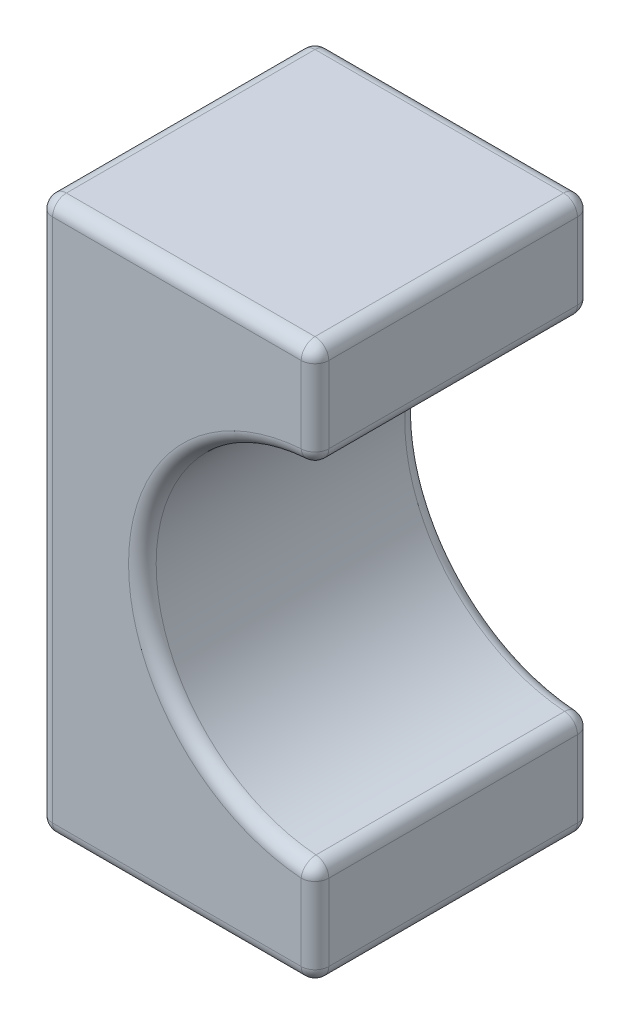
ISO-10303-21;
HEADER;
FILE_DESCRIPTION(('STEP AP214'),'2;1');
FILE_NAME('part.step','',(''),(''),'','','');
FILE_SCHEMA(('AUTOMOTIVE_DESIGN { 1 0 10303 214 1 1 1 1 }'));
ENDSEC;
DATA;
#1=APPLICATION_CONTEXT('core data for automotive mechanical design processes');
#2=APPLICATION_PROTOCOL_DEFINITION('international standard','automotive_design',2000,#1);
#3=PRODUCT_CONTEXT('',#1,'mechanical');
#4=PRODUCT('Part','Part','',(#3));
#5=PRODUCT_RELATED_PRODUCT_CATEGORY('part','',(#4));
#6=PRODUCT_DEFINITION_FORMATION('','',#4);
#7=PRODUCT_DEFINITION_CONTEXT('part definition',#1,'design');
#8=PRODUCT_DEFINITION('design','',#6,#7);
#9=PRODUCT_DEFINITION_SHAPE('','',#8);
#10=(LENGTH_UNIT() NAMED_UNIT(*) SI_UNIT(.MILLI.,.METRE.));
#11=(NAMED_UNIT(*) PLANE_ANGLE_UNIT() SI_UNIT($,.RADIAN.));
#12=(NAMED_UNIT(*) SI_UNIT($,.STERADIAN.) SOLID_ANGLE_UNIT());
#13=UNCERTAINTY_MEASURE_WITH_UNIT(LENGTH_MEASURE(1.E-05),#10,'distance_accuracy_value','');
#14=(GEOMETRIC_REPRESENTATION_CONTEXT(3) GLOBAL_UNCERTAINTY_ASSIGNED_CONTEXT((#13)) GLOBAL_UNIT_ASSIGNED_CONTEXT((#10,
#11,#12)) REPRESENTATION_CONTEXT('',''));
#15=CARTESIAN_POINT('',(0.,0.,0.));
#16=DIRECTION('',(0.,0.,1.));
#17=DIRECTION('',(1.,0.,0.));
#18=AXIS2_PLACEMENT_3D('',#15,#16,#17);
#19=CARTESIAN_POINT('',(10.,40.,10.));
#20=DIRECTION('',(-1.,0.,0.));
#21=DIRECTION('',(0.,0.,1.));
#22=AXIS2_PLACEMENT_3D('',#19,#20,#21);
#23=PLANE('',#22);
#24=DIRECTION('',(0.,-1.,0.));
#25=VECTOR('',#24,1.);
#26=CARTESIAN_POINT('',(10.,40.,-9.));
#27=LINE('',#26,#25);
#28=CARTESIAN_POINT('',(10.,33.4629120178363,-9.));
#29=VERTEX_POINT('',#28);
#30=CARTESIAN_POINT('',(10.,39.,-9.));
#31=VERTEX_POINT('',#30);
#32=EDGE_CURVE('E349',#29,#31,#27,.F.);
#33=ORIENTED_EDGE('',*,*,#32,.T.);
#34=DIRECTION('',(0.,0.,-1.));
#35=VECTOR('',#34,1.);
#36=CARTESIAN_POINT('',(10.,39.,10.));
#37=LINE('',#36,#35);
#38=CARTESIAN_POINT('',(10.,39.,9.));
#39=VERTEX_POINT('',#38);
#40=EDGE_CURVE('E11',#31,#39,#37,.F.);
#41=ORIENTED_EDGE('',*,*,#40,.T.);
#42=DIRECTION('',(0.,-1.,0.));
#43=VECTOR('',#42,1.);
#44=CARTESIAN_POINT('',(10.,40.,9.));
#45=LINE('',#44,#43);
#46=CARTESIAN_POINT('',(10.,33.4629120178363,9.));
#47=VERTEX_POINT('',#46);
#48=EDGE_CURVE('E346',#39,#47,#45,.T.);
#49=ORIENTED_EDGE('',*,*,#48,.T.);
#50=DIRECTION('',(0.,0.,-1.));
#51=VECTOR('',#50,1.);
#52=CARTESIAN_POINT('',(10.,33.4629120178363,-9.00000000000001));
#53=LINE('',#52,#51);
#54=EDGE_CURVE('E45',#47,#29,#53,.T.);
#55=ORIENTED_EDGE('',*,*,#54,.T.);
#56=EDGE_LOOP('',(#33,#41,#49,#55));
#57=FACE_BOUND('',#56,.T.);
#58=ADVANCED_FACE('F36',(#57),#23,.F.);
#59=CARTESIAN_POINT('',(9.,40.,-9.));
#60=DIRECTION('',(0.,-1.,0.));
#61=DIRECTION('',(0.,0.,-1.));
#62=AXIS2_PLACEMENT_3D('',#59,#60,#61);
#63=CYLINDRICAL_SURFACE('',#62,1.);
#64=DIRECTION('',(0.,-1.,0.));
#65=VECTOR('',#64,1.);
#66=CARTESIAN_POINT('',(9.,40.,-10.));
#67=LINE('',#66,#65);
#68=CARTESIAN_POINT('',(9.,39.,-10.));
#69=VERTEX_POINT('',#68);
#70=CARTESIAN_POINT('',(9.,33.4629120178363,-10.));
#71=VERTEX_POINT('',#70);
#72=EDGE_CURVE('E347',#69,#71,#67,.T.);
#73=ORIENTED_EDGE('',*,*,#72,.F.);
#74=CARTESIAN_POINT('',(9.,39.,-9.));
#75=DIRECTION('',(0.,-1.,0.));
#76=DIRECTION('',(0.,0.,-1.));
#77=AXIS2_PLACEMENT_3D('',#74,#75,#76);
#78=CIRCLE('',#77,1.);
#79=EDGE_CURVE('E242',#69,#31,#78,.T.);
#80=ORIENTED_EDGE('',*,*,#79,.T.);
#81=ORIENTED_EDGE('',*,*,#32,.F.);
#82=CARTESIAN_POINT('',(9.,33.4629120178363,-9.));
#83=DIRECTION('',(0.,-1.,0.));
#84=DIRECTION('',(0.,0.,-1.));
#85=AXIS2_PLACEMENT_3D('',#82,#83,#84);
#86=CIRCLE('',#85,1.);
#87=EDGE_CURVE('E239',#29,#71,#86,.F.);
#88=ORIENTED_EDGE('',*,*,#87,.T.);
#89=EDGE_LOOP('',(#73,#80,#81,#88));
#90=FACE_BOUND('',#89,.T.);
#91=ADVANCED_FACE('F394',(#90),#63,.T.);
#92=CARTESIAN_POINT('',(9.,6.53708798216374,-10.));
#93=VERTEX_POINT('',#92);
#94=CARTESIAN_POINT('',(9.,1.,-10.));
#95=VERTEX_POINT('',#94);
#96=EDGE_CURVE('E351',#93,#95,#67,.T.);
#97=ORIENTED_EDGE('',*,*,#96,.F.);
#98=CARTESIAN_POINT('',(9.,6.53708798216374,-9.));
#99=DIRECTION('',(0.,-1.,0.));
#100=DIRECTION('',(0.,0.,-1.));
#101=AXIS2_PLACEMENT_3D('',#98,#99,#100);
#102=CIRCLE('',#101,1.);
#103=CARTESIAN_POINT('',(10.,6.53708798216374,-9.));
#104=VERTEX_POINT('',#103);
#105=EDGE_CURVE('E254',#93,#104,#102,.T.);
#106=ORIENTED_EDGE('',*,*,#105,.T.);
#107=CARTESIAN_POINT('',(10.,1.,-9.));
#108=VERTEX_POINT('',#107);
#109=EDGE_CURVE('E355',#108,#104,#27,.F.);
#110=ORIENTED_EDGE('',*,*,#109,.F.);
#111=CARTESIAN_POINT('',(9.,1.,-9.));
#112=DIRECTION('',(0.,-1.,0.));
#113=DIRECTION('',(0.,0.,-1.));
#114=AXIS2_PLACEMENT_3D('',#111,#112,#113);
#115=CIRCLE('',#114,1.);
#116=EDGE_CURVE('E252',#108,#95,#115,.F.);
#117=ORIENTED_EDGE('',*,*,#116,.T.);
#118=EDGE_LOOP('',(#97,#106,#110,#117));
#119=FACE_BOUND('',#118,.T.);
#120=ADVANCED_FACE('F412',(#119),#63,.T.);
#121=CARTESIAN_POINT('',(9.,40.,9.));
#122=DIRECTION('',(0.,-1.,0.));
#123=DIRECTION('',(0.,0.,-1.));
#124=AXIS2_PLACEMENT_3D('',#121,#122,#123);
#125=CYLINDRICAL_SURFACE('',#124,1.);
#126=ORIENTED_EDGE('',*,*,#48,.F.);
#127=CARTESIAN_POINT('',(9.,39.,9.));
#128=DIRECTION('',(0.,-1.,0.));
#129=DIRECTION('',(0.,0.,-1.));
#130=AXIS2_PLACEMENT_3D('',#127,#128,#129);
#131=CIRCLE('',#130,1.);
#132=CARTESIAN_POINT('',(9.,39.,10.));
#133=VERTEX_POINT('',#132);
#134=EDGE_CURVE('E184',#39,#133,#131,.T.);
#135=ORIENTED_EDGE('',*,*,#134,.T.);
#136=DIRECTION('',(0.,-1.,0.));
#137=VECTOR('',#136,1.);
#138=CARTESIAN_POINT('',(9.,40.,10.));
#139=LINE('',#138,#137);
#140=CARTESIAN_POINT('',(9.,33.4629120178363,10.));
#141=VERTEX_POINT('',#140);
#142=EDGE_CURVE('E166',#141,#133,#139,.F.);
#143=ORIENTED_EDGE('',*,*,#142,.F.);
#144=CARTESIAN_POINT('',(9.,33.4629120178363,9.));
#145=DIRECTION('',(0.,-1.,0.));
#146=DIRECTION('',(0.,0.,-1.));
#147=AXIS2_PLACEMENT_3D('',#144,#145,#146);
#148=CIRCLE('',#147,1.);
#149=EDGE_CURVE('E181',#141,#47,#148,.F.);
#150=ORIENTED_EDGE('',*,*,#149,.T.);
#151=EDGE_LOOP('',(#126,#135,#143,#150));
#152=FACE_BOUND('',#151,.T.);
#153=ADVANCED_FACE('F179',(#152),#125,.T.);
#154=CARTESIAN_POINT('',(10.,6.53708798216374,9.));
#155=VERTEX_POINT('',#154);
#156=CARTESIAN_POINT('',(10.,1.,9.));
#157=VERTEX_POINT('',#156);
#158=EDGE_CURVE('E339',#155,#157,#45,.T.);
#159=ORIENTED_EDGE('',*,*,#158,.F.);
#160=CARTESIAN_POINT('',(9.,6.53708798216374,9.));
#161=DIRECTION('',(0.,-1.,0.));
#162=DIRECTION('',(0.,0.,-1.));
#163=AXIS2_PLACEMENT_3D('',#160,#161,#162);
#164=CIRCLE('',#163,1.);
#165=CARTESIAN_POINT('',(9.,6.53708798216374,10.));
#166=VERTEX_POINT('',#165);
#167=EDGE_CURVE('E262',#155,#166,#164,.T.);
#168=ORIENTED_EDGE('',*,*,#167,.T.);
#169=CARTESIAN_POINT('',(9.,1.,10.));
#170=VERTEX_POINT('',#169);
#171=EDGE_CURVE('E168',#170,#166,#139,.F.);
#172=ORIENTED_EDGE('',*,*,#171,.F.);
#173=CARTESIAN_POINT('',(9.,1.,9.));
#174=DIRECTION('',(0.,-1.,0.));
#175=DIRECTION('',(0.,0.,-1.));
#176=AXIS2_PLACEMENT_3D('',#173,#174,#175);
#177=CIRCLE('',#176,1.);
#178=EDGE_CURVE('E260',#170,#157,#177,.F.);
#179=ORIENTED_EDGE('',*,*,#178,.T.);
#180=EDGE_LOOP('',(#159,#168,#172,#179));
#181=FACE_BOUND('',#180,.T.);
#182=ADVANCED_FACE('F338',(#181),#125,.T.);
#183=ORIENTED_EDGE('',*,*,#109,.T.);
#184=DIRECTION('',(0.,0.,-1.));
#185=VECTOR('',#184,1.);
#186=CARTESIAN_POINT('',(10.,6.53708798216374,9.00000000000001));
#187=LINE('',#186,#185);
#188=EDGE_CURVE('E258',#104,#155,#187,.F.);
#189=ORIENTED_EDGE('',*,*,#188,.T.);
#190=ORIENTED_EDGE('',*,*,#158,.T.);
#191=DIRECTION('',(0.,0.,-1.));
#192=VECTOR('',#191,1.);
#193=CARTESIAN_POINT('',(10.,1.,-9.));
#194=LINE('',#193,#192);
#195=EDGE_CURVE('E256',#157,#108,#194,.T.);
#196=ORIENTED_EDGE('',*,*,#195,.T.);
#197=EDGE_LOOP('',(#183,#189,#190,#196));
#198=FACE_BOUND('',#197,.T.);
#199=ADVANCED_FACE('F343',(#198),#23,.F.);
#200=CARTESIAN_POINT('',(-10.,40.,-10.));
#201=DIRECTION('',(0.,0.,1.));
#202=DIRECTION('',(1.,0.,0.));
#203=AXIS2_PLACEMENT_3D('',#200,#201,#202);
#204=PLANE('',#203);
#205=DIRECTION('',(0.,-1.,0.));
#206=VECTOR('',#205,1.);
#207=CARTESIAN_POINT('',(-9.,40.,-10.));
#208=LINE('',#207,#206);
#209=CARTESIAN_POINT('',(-9.,1.,-10.));
#210=VERTEX_POINT('',#209);
#211=CARTESIAN_POINT('',(-9.,39.,-10.));
#212=VERTEX_POINT('',#211);
#213=EDGE_CURVE('E294',#210,#212,#208,.F.);
#214=ORIENTED_EDGE('',*,*,#213,.T.);
#215=DIRECTION('',(-1.,0.,0.));
#216=VECTOR('',#215,1.);
#217=CARTESIAN_POINT('',(-10.,39.,-10.));
#218=LINE('',#217,#216);
#219=EDGE_CURVE('E237',#212,#69,#218,.F.);
#220=ORIENTED_EDGE('',*,*,#219,.T.);
#221=ORIENTED_EDGE('',*,*,#72,.T.);
#222=CARTESIAN_POINT('',(10.,20.,-10.));
#223=DIRECTION('',(0.,0.,1.));
#224=DIRECTION('',(1.,0.,0.));
#225=AXIS2_PLACEMENT_3D('',#222,#223,#224);
#226=CIRCLE('',#225,13.5);
#227=EDGE_CURVE('E235',#71,#93,#226,.T.);
#228=ORIENTED_EDGE('',*,*,#227,.T.);
#229=ORIENTED_EDGE('',*,*,#96,.T.);
#230=DIRECTION('',(-1.,0.,0.));
#231=VECTOR('',#230,1.);
#232=CARTESIAN_POINT('',(-9.,1.,-10.));
#233=LINE('',#232,#231);
#234=EDGE_CURVE('E233',#95,#210,#233,.T.);
#235=ORIENTED_EDGE('',*,*,#234,.T.);
#236=EDGE_LOOP('',(#214,#220,#221,#228,#229,#235));
#237=FACE_BOUND('',#236,.T.);
#238=ADVANCED_FACE('F392',(#237),#204,.F.);
#239=CARTESIAN_POINT('',(-10.,40.,10.));
#240=DIRECTION('',(1.,0.,0.));
#241=DIRECTION('',(0.,0.,-1.));
#242=AXIS2_PLACEMENT_3D('',#239,#240,#241);
#243=PLANE('',#242);
#244=DIRECTION('',(0.,-1.,0.));
#245=VECTOR('',#244,1.);
#246=CARTESIAN_POINT('',(-10.,40.,9.));
#247=LINE('',#246,#245);
#248=CARTESIAN_POINT('',(-10.,1.,9.));
#249=VERTEX_POINT('',#248);
#250=CARTESIAN_POINT('',(-10.,39.,9.));
#251=VERTEX_POINT('',#250);
#252=EDGE_CURVE('E201',#249,#251,#247,.F.);
#253=ORIENTED_EDGE('',*,*,#252,.T.);
#254=DIRECTION('',(0.,0.,1.));
#255=VECTOR('',#254,1.);
#256=CARTESIAN_POINT('',(-10.,39.,10.));
#257=LINE('',#256,#255);
#258=CARTESIAN_POINT('',(-10.,39.,-9.));
#259=VERTEX_POINT('',#258);
#260=EDGE_CURVE('E226',#251,#259,#257,.F.);
#261=ORIENTED_EDGE('',*,*,#260,.T.);
#262=DIRECTION('',(0.,-1.,0.));
#263=VECTOR('',#262,1.);
#264=CARTESIAN_POINT('',(-10.,40.,-9.));
#265=LINE('',#264,#263);
#266=CARTESIAN_POINT('',(-10.,1.,-9.));
#267=VERTEX_POINT('',#266);
#268=EDGE_CURVE('E206',#259,#267,#265,.T.);
#269=ORIENTED_EDGE('',*,*,#268,.T.);
#270=DIRECTION('',(0.,0.,1.));
#271=VECTOR('',#270,1.);
#272=CARTESIAN_POINT('',(-10.,1.,9.));
#273=LINE('',#272,#271);
#274=EDGE_CURVE('E224',#267,#249,#273,.T.);
#275=ORIENTED_EDGE('',*,*,#274,.T.);
#276=EDGE_LOOP('',(#253,#261,#269,#275));
#277=FACE_BOUND('',#276,.T.);
#278=ADVANCED_FACE('F361',(#277),#243,.F.);
#279=CARTESIAN_POINT('',(-10.,40.,10.));
#280=DIRECTION('',(0.,0.,-1.));
#281=DIRECTION('',(-1.,0.,0.));
#282=AXIS2_PLACEMENT_3D('',#279,#280,#281);
#283=PLANE('',#282);
#284=ORIENTED_EDGE('',*,*,#142,.T.);
#285=DIRECTION('',(1.,0.,0.));
#286=VECTOR('',#285,1.);
#287=CARTESIAN_POINT('',(-10.,39.,10.));
#288=LINE('',#287,#286);
#289=CARTESIAN_POINT('',(-9.,39.,10.));
#290=VERTEX_POINT('',#289);
#291=EDGE_CURVE('E173',#133,#290,#288,.F.);
#292=ORIENTED_EDGE('',*,*,#291,.T.);
#293=DIRECTION('',(0.,-1.,0.));
#294=VECTOR('',#293,1.);
#295=CARTESIAN_POINT('',(-9.,40.,10.));
#296=LINE('',#295,#294);
#297=CARTESIAN_POINT('',(-9.,1.,10.));
#298=VERTEX_POINT('',#297);
#299=EDGE_CURVE('E185',#290,#298,#296,.T.);
#300=ORIENTED_EDGE('',*,*,#299,.T.);
#301=DIRECTION('',(1.,0.,0.));
#302=VECTOR('',#301,1.);
#303=CARTESIAN_POINT('',(9.,1.,10.));
#304=LINE('',#303,#302);
#305=EDGE_CURVE('E174',#298,#170,#304,.T.);
#306=ORIENTED_EDGE('',*,*,#305,.T.);
#307=ORIENTED_EDGE('',*,*,#171,.T.);
#308=CARTESIAN_POINT('',(10.,20.,10.));
#309=DIRECTION('',(0.,0.,-1.));
#310=DIRECTION('',(-1.,0.,0.));
#311=AXIS2_PLACEMENT_3D('',#308,#309,#310);
#312=CIRCLE('',#311,13.5);
#313=EDGE_CURVE('E163',#166,#141,#312,.T.);
#314=ORIENTED_EDGE('',*,*,#313,.T.);
#315=EDGE_LOOP('',(#284,#292,#300,#306,#307,#314));
#316=FACE_BOUND('',#315,.T.);
#317=ADVANCED_FACE('F165',(#316),#283,.F.);
#318=CARTESIAN_POINT('',(0.,40.,0.));
#319=DIRECTION('',(0.,-1.,0.));
#320=DIRECTION('',(0.,0.,-1.));
#321=AXIS2_PLACEMENT_3D('',#318,#319,#320);
#322=PLANE('',#321);
#323=DIRECTION('',(0.,0.,1.));
#324=VECTOR('',#323,1.);
#325=CARTESIAN_POINT('',(-9.,40.,0.));
#326=LINE('',#325,#324);
#327=CARTESIAN_POINT('',(-9.,40.,-9.));
#328=VERTEX_POINT('',#327);
#329=CARTESIAN_POINT('',(-9.,40.,9.));
#330=VERTEX_POINT('',#329);
#331=EDGE_CURVE('E213',#328,#330,#326,.T.);
#332=ORIENTED_EDGE('',*,*,#331,.T.);
#333=DIRECTION('',(1.,0.,0.));
#334=VECTOR('',#333,1.);
#335=CARTESIAN_POINT('',(0.,40.,9.));
#336=LINE('',#335,#334);
#337=CARTESIAN_POINT('',(9.,40.,9.));
#338=VERTEX_POINT('',#337);
#339=EDGE_CURVE('E215',#330,#338,#336,.T.);
#340=ORIENTED_EDGE('',*,*,#339,.T.);
#341=DIRECTION('',(0.,0.,-1.));
#342=VECTOR('',#341,1.);
#343=CARTESIAN_POINT('',(9.,40.,0.));
#344=LINE('',#343,#342);
#345=CARTESIAN_POINT('',(9.,40.,-9.));
#346=VERTEX_POINT('',#345);
#347=EDGE_CURVE('E203',#338,#346,#344,.T.);
#348=ORIENTED_EDGE('',*,*,#347,.T.);
#349=DIRECTION('',(-1.,0.,0.));
#350=VECTOR('',#349,1.);
#351=CARTESIAN_POINT('',(0.,40.,-9.));
#352=LINE('',#351,#350);
#353=EDGE_CURVE('E211',#346,#328,#352,.T.);
#354=ORIENTED_EDGE('',*,*,#353,.T.);
#355=EDGE_LOOP('',(#332,#340,#348,#354));
#356=FACE_BOUND('',#355,.T.);
#357=ADVANCED_FACE('F382',(#356),#322,.F.);
#358=CARTESIAN_POINT('',(0.,0.,0.));
#359=DIRECTION('',(0.,-1.,0.));
#360=DIRECTION('',(0.,0.,-1.));
#361=AXIS2_PLACEMENT_3D('',#358,#359,#360);
#362=PLANE('',#361);
#363=DIRECTION('',(1.,0.,0.));
#364=VECTOR('',#363,1.);
#365=CARTESIAN_POINT('',(-9.,0.,9.));
#366=LINE('',#365,#364);
#367=CARTESIAN_POINT('',(9.,0.,9.));
#368=VERTEX_POINT('',#367);
#369=CARTESIAN_POINT('',(-9.,0.,9.));
#370=VERTEX_POINT('',#369);
#371=EDGE_CURVE('E53',#368,#370,#366,.F.);
#372=ORIENTED_EDGE('',*,*,#371,.T.);
#373=DIRECTION('',(0.,0.,1.));
#374=VECTOR('',#373,1.);
#375=CARTESIAN_POINT('',(-9.,0.,-9.));
#376=LINE('',#375,#374);
#377=CARTESIAN_POINT('',(-9.,0.,-9.));
#378=VERTEX_POINT('',#377);
#379=EDGE_CURVE('E268',#370,#378,#376,.F.);
#380=ORIENTED_EDGE('',*,*,#379,.T.);
#381=DIRECTION('',(-1.,0.,0.));
#382=VECTOR('',#381,1.);
#383=CARTESIAN_POINT('',(9.,0.,-9.));
#384=LINE('',#383,#382);
#385=CARTESIAN_POINT('',(9.,0.,-9.));
#386=VERTEX_POINT('',#385);
#387=EDGE_CURVE('E264',#378,#386,#384,.F.);
#388=ORIENTED_EDGE('',*,*,#387,.T.);
#389=DIRECTION('',(0.,0.,-1.));
#390=VECTOR('',#389,1.);
#391=CARTESIAN_POINT('',(9.,0.,9.));
#392=LINE('',#391,#390);
#393=EDGE_CURVE('E58',#386,#368,#392,.F.);
#394=ORIENTED_EDGE('',*,*,#393,.T.);
#395=EDGE_LOOP('',(#372,#380,#388,#394));
#396=FACE_BOUND('',#395,.T.);
#397=ADVANCED_FACE('F456',(#396),#362,.T.);
#398=CARTESIAN_POINT('',(-9.,40.,9.));
#399=DIRECTION('',(0.,-1.,0.));
#400=DIRECTION('',(0.,0.,-1.));
#401=AXIS2_PLACEMENT_3D('',#398,#399,#400);
#402=CYLINDRICAL_SURFACE('',#401,1.);
#403=ORIENTED_EDGE('',*,*,#299,.F.);
#404=CARTESIAN_POINT('',(-9.,39.,9.));
#405=DIRECTION('',(0.,-1.,0.));
#406=DIRECTION('',(0.,0.,-1.));
#407=AXIS2_PLACEMENT_3D('',#404,#405,#406);
#408=CIRCLE('',#407,1.);
#409=EDGE_CURVE('E222',#290,#251,#408,.T.);
#410=ORIENTED_EDGE('',*,*,#409,.T.);
#411=ORIENTED_EDGE('',*,*,#252,.F.);
#412=CARTESIAN_POINT('',(-9.,1.,9.));
#413=DIRECTION('',(0.,-1.,0.));
#414=DIRECTION('',(0.,0.,-1.));
#415=AXIS2_PLACEMENT_3D('',#412,#413,#414);
#416=CIRCLE('',#415,1.);
#417=EDGE_CURVE('E220',#249,#298,#416,.F.);
#418=ORIENTED_EDGE('',*,*,#417,.T.);
#419=EDGE_LOOP('',(#403,#410,#411,#418));
#420=FACE_BOUND('',#419,.T.);
#421=ADVANCED_FACE('F453',(#420),#402,.T.);
#422=CARTESIAN_POINT('',(-9.,40.,-9.));
#423=DIRECTION('',(0.,-1.,0.));
#424=DIRECTION('',(0.,0.,-1.));
#425=AXIS2_PLACEMENT_3D('',#422,#423,#424);
#426=CYLINDRICAL_SURFACE('',#425,1.);
#427=ORIENTED_EDGE('',*,*,#268,.F.);
#428=CARTESIAN_POINT('',(-9.,39.,-9.));
#429=DIRECTION('',(0.,-1.,0.));
#430=DIRECTION('',(0.,0.,-1.));
#431=AXIS2_PLACEMENT_3D('',#428,#429,#430);
#432=CIRCLE('',#431,1.);
#433=EDGE_CURVE('E231',#259,#212,#432,.T.);
#434=ORIENTED_EDGE('',*,*,#433,.T.);
#435=ORIENTED_EDGE('',*,*,#213,.F.);
#436=CARTESIAN_POINT('',(-9.,1.,-9.));
#437=DIRECTION('',(0.,-1.,0.));
#438=DIRECTION('',(0.,0.,-1.));
#439=AXIS2_PLACEMENT_3D('',#436,#437,#438);
#440=CIRCLE('',#439,1.);
#441=EDGE_CURVE('E228',#210,#267,#440,.F.);
#442=ORIENTED_EDGE('',*,*,#441,.T.);
#443=EDGE_LOOP('',(#427,#434,#435,#442));
#444=FACE_BOUND('',#443,.T.);
#445=ADVANCED_FACE('F367',(#444),#426,.T.);
#446=CARTESIAN_POINT('',(10.,20.,-72.4872435695794));
#447=DIRECTION('',(0.,0.,1.));
#448=DIRECTION('',(1.,0.,0.));
#449=AXIS2_PLACEMENT_3D('',#446,#447,#448);
#450=CYLINDRICAL_SURFACE('',#449,12.5);
#451=DIRECTION('',(0.,0.,1.));
#452=VECTOR('',#451,1.);
#453=CARTESIAN_POINT('',(9.07407407407407,7.53434072422568,-72.4872435695794));
#454=LINE('',#453,#452);
#455=CARTESIAN_POINT('',(9.07407407407407,7.53434072422569,9.00000000000001));
#456=VERTEX_POINT('',#455);
#457=CARTESIAN_POINT('',(9.07407407407407,7.53434072422568,-9.));
#458=VERTEX_POINT('',#457);
#459=EDGE_CURVE('E247',#456,#458,#454,.F.);
#460=ORIENTED_EDGE('',*,*,#459,.T.);
#461=CARTESIAN_POINT('',(10.,20.,-9.00000000000001));
#462=DIRECTION('',(0.,0.,1.));
#463=DIRECTION('',(1.,0.,0.));
#464=AXIS2_PLACEMENT_3D('',#461,#462,#463);
#465=CIRCLE('',#464,12.5);
#466=CARTESIAN_POINT('',(9.07407407407407,32.4656592757743,-9.));
#467=VERTEX_POINT('',#466);
#468=EDGE_CURVE('E249',#458,#467,#465,.F.);
#469=ORIENTED_EDGE('',*,*,#468,.T.);
#470=DIRECTION('',(0.,0.,1.));
#471=VECTOR('',#470,1.);
#472=CARTESIAN_POINT('',(9.07407407407407,32.4656592757743,-72.4872435695794));
#473=LINE('',#472,#471);
#474=CARTESIAN_POINT('',(9.07407407407407,32.4656592757743,9.));
#475=VERTEX_POINT('',#474);
#476=EDGE_CURVE('E244',#467,#475,#473,.T.);
#477=ORIENTED_EDGE('',*,*,#476,.T.);
#478=CARTESIAN_POINT('',(10.,20.,9.00000000000001));
#479=DIRECTION('',(0.,0.,-1.));
#480=DIRECTION('',(-1.,0.,0.));
#481=AXIS2_PLACEMENT_3D('',#478,#479,#480);
#482=CIRCLE('',#481,12.5);
#483=EDGE_CURVE('E191',#475,#456,#482,.F.);
#484=ORIENTED_EDGE('',*,*,#483,.T.);
#485=EDGE_LOOP('',(#460,#469,#477,#484));
#486=FACE_BOUND('',#485,.T.);
#487=ADVANCED_FACE('F459',(#486),#450,.F.);
#488=CARTESIAN_POINT('',(-9.,39.,-9.));
#489=DIRECTION('',(0.,-1.,0.));
#490=DIRECTION('',(0.,0.,-1.));
#491=AXIS2_PLACEMENT_3D('',#488,#489,#490);
#492=SPHERICAL_SURFACE('',#491,1.);
#493=CARTESIAN_POINT('',(-9.,39.,-9.));
#494=DIRECTION('',(1.,0.,0.));
#495=DIRECTION('',(0.,0.,-1.));
#496=AXIS2_PLACEMENT_3D('',#493,#494,#495);
#497=CIRCLE('',#496,1.);
#498=EDGE_CURVE('E288',#212,#328,#497,.T.);
#499=ORIENTED_EDGE('',*,*,#498,.F.);
#500=ORIENTED_EDGE('',*,*,#433,.F.);
#501=CARTESIAN_POINT('',(-9.,39.,-9.));
#502=DIRECTION('',(0.,0.,1.));
#503=DIRECTION('',(1.,0.,0.));
#504=AXIS2_PLACEMENT_3D('',#501,#502,#503);
#505=CIRCLE('',#504,1.);
#506=EDGE_CURVE('E291',#328,#259,#505,.T.);
#507=ORIENTED_EDGE('',*,*,#506,.F.);
#508=EDGE_LOOP('',(#499,#500,#507));
#509=FACE_BOUND('',#508,.T.);
#510=ADVANCED_FACE('F374',(#509),#492,.T.);
#511=CARTESIAN_POINT('',(-9.,39.,0.));
#512=DIRECTION('',(0.,0.,1.));
#513=DIRECTION('',(1.,0.,0.));
#514=AXIS2_PLACEMENT_3D('',#511,#512,#513);
#515=CYLINDRICAL_SURFACE('',#514,1.);
#516=ORIENTED_EDGE('',*,*,#506,.T.);
#517=ORIENTED_EDGE('',*,*,#260,.F.);
#518=CARTESIAN_POINT('',(-9.,39.,9.));
#519=DIRECTION('',(0.,0.,1.));
#520=DIRECTION('',(1.,0.,0.));
#521=AXIS2_PLACEMENT_3D('',#518,#519,#520);
#522=CIRCLE('',#521,1.);
#523=EDGE_CURVE('E285',#330,#251,#522,.T.);
#524=ORIENTED_EDGE('',*,*,#523,.F.);
#525=ORIENTED_EDGE('',*,*,#331,.F.);
#526=EDGE_LOOP('',(#516,#517,#524,#525));
#527=FACE_BOUND('',#526,.T.);
#528=ADVANCED_FACE('F378',(#527),#515,.T.);
#529=CARTESIAN_POINT('',(0.,39.,-9.));
#530=DIRECTION('',(-1.,0.,0.));
#531=DIRECTION('',(0.,0.,1.));
#532=AXIS2_PLACEMENT_3D('',#529,#530,#531);
#533=CYLINDRICAL_SURFACE('',#532,1.);
#534=ORIENTED_EDGE('',*,*,#498,.T.);
#535=ORIENTED_EDGE('',*,*,#353,.F.);
#536=CARTESIAN_POINT('',(9.,39.,-9.));
#537=DIRECTION('',(1.,0.,0.));
#538=DIRECTION('',(0.,0.,-1.));
#539=AXIS2_PLACEMENT_3D('',#536,#537,#538);
#540=CIRCLE('',#539,1.);
#541=EDGE_CURVE('E282',#69,#346,#540,.T.);
#542=ORIENTED_EDGE('',*,*,#541,.F.);
#543=ORIENTED_EDGE('',*,*,#219,.F.);
#544=EDGE_LOOP('',(#534,#535,#542,#543));
#545=FACE_BOUND('',#544,.T.);
#546=ADVANCED_FACE('F388',(#545),#533,.T.);
#547=CARTESIAN_POINT('',(-9.,39.,9.));
#548=DIRECTION('',(0.,-1.,0.));
#549=DIRECTION('',(0.,0.,-1.));
#550=AXIS2_PLACEMENT_3D('',#547,#548,#549);
#551=SPHERICAL_SURFACE('',#550,1.);
#552=ORIENTED_EDGE('',*,*,#523,.T.);
#553=ORIENTED_EDGE('',*,*,#409,.F.);
#554=CARTESIAN_POINT('',(-9.,39.,9.));
#555=DIRECTION('',(1.,0.,0.));
#556=DIRECTION('',(0.,0.,-1.));
#557=AXIS2_PLACEMENT_3D('',#554,#555,#556);
#558=CIRCLE('',#557,1.);
#559=EDGE_CURVE('E279',#330,#290,#558,.T.);
#560=ORIENTED_EDGE('',*,*,#559,.F.);
#561=EDGE_LOOP('',(#552,#553,#560));
#562=FACE_BOUND('',#561,.T.);
#563=ADVANCED_FACE('F471',(#562),#551,.T.);
#564=CARTESIAN_POINT('',(9.,39.,-9.));
#565=DIRECTION('',(0.,-1.,0.));
#566=DIRECTION('',(0.,0.,-1.));
#567=AXIS2_PLACEMENT_3D('',#564,#565,#566);
#568=SPHERICAL_SURFACE('',#567,1.);
#569=ORIENTED_EDGE('',*,*,#79,.F.);
#570=ORIENTED_EDGE('',*,*,#541,.T.);
#571=CARTESIAN_POINT('',(9.,39.,-9.));
#572=DIRECTION('',(0.,0.,1.));
#573=DIRECTION('',(1.,0.,0.));
#574=AXIS2_PLACEMENT_3D('',#571,#572,#573);
#575=CIRCLE('',#574,1.);
#576=EDGE_CURVE('E276',#31,#346,#575,.T.);
#577=ORIENTED_EDGE('',*,*,#576,.F.);
#578=EDGE_LOOP('',(#569,#570,#577));
#579=FACE_BOUND('',#578,.T.);
#580=ADVANCED_FACE('F467',(#579),#568,.T.);
#581=CARTESIAN_POINT('',(0.,39.,9.));
#582=DIRECTION('',(1.,0.,0.));
#583=DIRECTION('',(0.,0.,-1.));
#584=AXIS2_PLACEMENT_3D('',#581,#582,#583);
#585=CYLINDRICAL_SURFACE('',#584,1.);
#586=ORIENTED_EDGE('',*,*,#559,.T.);
#587=ORIENTED_EDGE('',*,*,#291,.F.);
#588=CARTESIAN_POINT('',(9.,39.,9.));
#589=DIRECTION('',(1.,0.,0.));
#590=DIRECTION('',(0.,0.,-1.));
#591=AXIS2_PLACEMENT_3D('',#588,#589,#590);
#592=CIRCLE('',#591,1.);
#593=EDGE_CURVE('E273',#338,#133,#592,.T.);
#594=ORIENTED_EDGE('',*,*,#593,.F.);
#595=ORIENTED_EDGE('',*,*,#339,.F.);
#596=EDGE_LOOP('',(#586,#587,#594,#595));
#597=FACE_BOUND('',#596,.T.);
#598=ADVANCED_FACE('F463',(#597),#585,.T.);
#599=CARTESIAN_POINT('',(9.,39.,0.));
#600=DIRECTION('',(0.,0.,-1.));
#601=DIRECTION('',(-1.,0.,0.));
#602=AXIS2_PLACEMENT_3D('',#599,#600,#601);
#603=CYLINDRICAL_SURFACE('',#602,1.);
#604=ORIENTED_EDGE('',*,*,#576,.T.);
#605=ORIENTED_EDGE('',*,*,#347,.F.);
#606=CARTESIAN_POINT('',(9.,39.,9.));
#607=DIRECTION('',(0.,0.,1.));
#608=DIRECTION('',(1.,0.,0.));
#609=AXIS2_PLACEMENT_3D('',#606,#607,#608);
#610=CIRCLE('',#609,1.);
#611=EDGE_CURVE('E271',#39,#338,#610,.T.);
#612=ORIENTED_EDGE('',*,*,#611,.F.);
#613=ORIENTED_EDGE('',*,*,#40,.F.);
#614=EDGE_LOOP('',(#604,#605,#612,#613));
#615=FACE_BOUND('',#614,.T.);
#616=ADVANCED_FACE('F431',(#615),#603,.T.);
#617=CARTESIAN_POINT('',(9.,39.,9.));
#618=DIRECTION('',(0.,-1.,0.));
#619=DIRECTION('',(0.,0.,-1.));
#620=AXIS2_PLACEMENT_3D('',#617,#618,#619);
#621=SPHERICAL_SURFACE('',#620,1.);
#622=ORIENTED_EDGE('',*,*,#593,.T.);
#623=ORIENTED_EDGE('',*,*,#134,.F.);
#624=ORIENTED_EDGE('',*,*,#611,.T.);
#625=EDGE_LOOP('',(#622,#623,#624));
#626=FACE_BOUND('',#625,.T.);
#627=ADVANCED_FACE('F424',(#626),#621,.T.);
#628=CARTESIAN_POINT('',(9.,6.53708798216374,9.));
#629=DIRECTION('',(0.0740740740740741,0.997252742061945,0.));
#630=DIRECTION('',(-0.997252742061945,0.0740740740740741,0.));
#631=AXIS2_PLACEMENT_3D('',#628,#629,#630);
#632=SPHERICAL_SURFACE('',#631,1.);
#633=CARTESIAN_POINT('',(9.,6.53708798216374,9.));
#634=DIRECTION('',(0.,0.,-1.));
#635=DIRECTION('',(-1.,0.,0.));
#636=AXIS2_PLACEMENT_3D('',#633,#634,#635);
#637=CIRCLE('',#636,1.);
#638=EDGE_CURVE('E195',#456,#155,#637,.T.);
#639=ORIENTED_EDGE('',*,*,#638,.F.);
#640=CARTESIAN_POINT('',(9.,6.53708798216374,9.));
#641=DIRECTION('',(-0.997252742061945,0.0740740740740735,0.));
#642=DIRECTION('',(-0.0740740740740735,-0.997252742061945,0.));
#643=AXIS2_PLACEMENT_3D('',#640,#641,#642);
#644=CIRCLE('',#643,1.);
#645=EDGE_CURVE('E274',#166,#456,#644,.T.);
#646=ORIENTED_EDGE('',*,*,#645,.F.);
#647=ORIENTED_EDGE('',*,*,#167,.F.);
#648=EDGE_LOOP('',(#639,#646,#647));
#649=FACE_BOUND('',#648,.T.);
#650=ADVANCED_FACE('F422',(#649),#632,.T.);
#651=CARTESIAN_POINT('',(10.,20.,9.00000000000001));
#652=DIRECTION('',(0.,0.,-1.));
#653=DIRECTION('',(-1.,0.,0.));
#654=AXIS2_PLACEMENT_3D('',#651,#652,#653);
#655=TOROIDAL_SURFACE('',#654,13.5,1.);
#656=ORIENTED_EDGE('',*,*,#645,.T.);
#657=ORIENTED_EDGE('',*,*,#483,.F.);
#658=CARTESIAN_POINT('',(9.,33.4629120178363,9.));
#659=DIRECTION('',(0.997252742061945,0.0740740740740737,0.));
#660=DIRECTION('',(-0.0740740740740738,0.997252742061945,0.));
#661=AXIS2_PLACEMENT_3D('',#658,#659,#660);
#662=CIRCLE('',#661,1.);
#663=EDGE_CURVE('E189',#141,#475,#662,.T.);
#664=ORIENTED_EDGE('',*,*,#663,.F.);
#665=ORIENTED_EDGE('',*,*,#313,.F.);
#666=EDGE_LOOP('',(#656,#657,#664,#665));
#667=FACE_BOUND('',#666,.T.);
#668=ADVANCED_FACE('F190',(#667),#655,.T.);
#669=CARTESIAN_POINT('',(9.,6.53708798216374,-72.4872435695794));
#670=DIRECTION('',(0.,0.,1.));
#671=DIRECTION('',(1.,0.,0.));
#672=AXIS2_PLACEMENT_3D('',#669,#670,#671);
#673=CYLINDRICAL_SURFACE('',#672,1.);
#674=ORIENTED_EDGE('',*,*,#638,.T.);
#675=ORIENTED_EDGE('',*,*,#188,.F.);
#676=CARTESIAN_POINT('',(9.,6.53708798216374,-9.));
#677=DIRECTION('',(0.,0.,-1.));
#678=DIRECTION('',(-1.,0.,0.));
#679=AXIS2_PLACEMENT_3D('',#676,#677,#678);
#680=CIRCLE('',#679,1.);
#681=EDGE_CURVE('E196',#458,#104,#680,.T.);
#682=ORIENTED_EDGE('',*,*,#681,.F.);
#683=ORIENTED_EDGE('',*,*,#459,.F.);
#684=EDGE_LOOP('',(#674,#675,#682,#683));
#685=FACE_BOUND('',#684,.T.);
#686=ADVANCED_FACE('F419',(#685),#673,.T.);
#687=CARTESIAN_POINT('',(9.,33.4629120178363,9.));
#688=DIRECTION('',(0.0740740740740741,-0.997252742061945,0.));
#689=DIRECTION('',(0.997252742061945,0.0740740740740741,0.));
#690=AXIS2_PLACEMENT_3D('',#687,#688,#689);
#691=SPHERICAL_SURFACE('',#690,1.);
#692=ORIENTED_EDGE('',*,*,#149,.F.);
#693=ORIENTED_EDGE('',*,*,#663,.T.);
#694=CARTESIAN_POINT('',(9.,33.4629120178363,9.));
#695=DIRECTION('',(0.,0.,-1.));
#696=DIRECTION('',(-1.,0.,0.));
#697=AXIS2_PLACEMENT_3D('',#694,#695,#696);
#698=CIRCLE('',#697,1.);
#699=EDGE_CURVE('E199',#47,#475,#698,.T.);
#700=ORIENTED_EDGE('',*,*,#699,.F.);
#701=EDGE_LOOP('',(#692,#693,#700));
#702=FACE_BOUND('',#701,.T.);
#703=ADVANCED_FACE('F198',(#702),#691,.T.);
#704=CARTESIAN_POINT('',(9.,6.53708798216374,-9.));
#705=DIRECTION('',(0.0740740740740741,0.997252742061945,0.));
#706=DIRECTION('',(-0.997252742061945,0.0740740740740741,0.));
#707=AXIS2_PLACEMENT_3D('',#704,#705,#706);
#708=SPHERICAL_SURFACE('',#707,1.);
#709=ORIENTED_EDGE('',*,*,#681,.T.);
#710=ORIENTED_EDGE('',*,*,#105,.F.);
#711=CARTESIAN_POINT('',(9.,6.53708798216374,-9.));
#712=DIRECTION('',(-0.997252742061945,0.0740740740740736,0.));
#713=DIRECTION('',(-0.0740740740740736,-0.997252742061945,0.));
#714=AXIS2_PLACEMENT_3D('',#711,#712,#713);
#715=CIRCLE('',#714,1.);
#716=EDGE_CURVE('E300',#458,#93,#715,.T.);
#717=ORIENTED_EDGE('',*,*,#716,.F.);
#718=EDGE_LOOP('',(#709,#710,#717));
#719=FACE_BOUND('',#718,.T.);
#720=ADVANCED_FACE('F415',(#719),#708,.T.);
#721=CARTESIAN_POINT('',(9.,33.4629120178363,-72.4872435695794));
#722=DIRECTION('',(0.,0.,1.));
#723=DIRECTION('',(1.,0.,0.));
#724=AXIS2_PLACEMENT_3D('',#721,#722,#723);
#725=CYLINDRICAL_SURFACE('',#724,1.);
#726=ORIENTED_EDGE('',*,*,#699,.T.);
#727=ORIENTED_EDGE('',*,*,#476,.F.);
#728=CARTESIAN_POINT('',(9.,33.4629120178363,-9.));
#729=DIRECTION('',(0.,0.,-1.));
#730=DIRECTION('',(0.,1.,0.));
#731=AXIS2_PLACEMENT_3D('',#728,#729,#730);
#732=CIRCLE('',#731,1.);
#733=EDGE_CURVE('E297',#29,#467,#732,.T.);
#734=ORIENTED_EDGE('',*,*,#733,.F.);
#735=ORIENTED_EDGE('',*,*,#54,.F.);
#736=EDGE_LOOP('',(#726,#727,#734,#735));
#737=FACE_BOUND('',#736,.T.);
#738=ADVANCED_FACE('F486',(#737),#725,.T.);
#739=CARTESIAN_POINT('',(10.,20.,-9.00000000000001));
#740=DIRECTION('',(0.,0.,1.));
#741=DIRECTION('',(1.,0.,0.));
#742=AXIS2_PLACEMENT_3D('',#739,#740,#741);
#743=TOROIDAL_SURFACE('',#742,13.5,1.);
#744=ORIENTED_EDGE('',*,*,#716,.T.);
#745=ORIENTED_EDGE('',*,*,#227,.F.);
#746=CARTESIAN_POINT('',(9.,33.4629120178363,-9.00000000000001));
#747=DIRECTION('',(0.997252742061945,0.0740740740740737,0.));
#748=DIRECTION('',(-0.0740740740740737,0.997252742061945,0.));
#749=AXIS2_PLACEMENT_3D('',#746,#747,#748);
#750=CIRCLE('',#749,1.);
#751=EDGE_CURVE('E295',#467,#71,#750,.T.);
#752=ORIENTED_EDGE('',*,*,#751,.F.);
#753=ORIENTED_EDGE('',*,*,#468,.F.);
#754=EDGE_LOOP('',(#744,#745,#752,#753));
#755=FACE_BOUND('',#754,.T.);
#756=ADVANCED_FACE('F405',(#755),#743,.T.);
#757=CARTESIAN_POINT('',(9.,33.4629120178363,-9.));
#758=DIRECTION('',(0.0740740740740741,-0.997252742061945,0.));
#759=DIRECTION('',(0.997252742061945,0.0740740740740741,0.));
#760=AXIS2_PLACEMENT_3D('',#757,#758,#759);
#761=SPHERICAL_SURFACE('',#760,1.);
#762=ORIENTED_EDGE('',*,*,#87,.F.);
#763=ORIENTED_EDGE('',*,*,#733,.T.);
#764=ORIENTED_EDGE('',*,*,#751,.T.);
#765=EDGE_LOOP('',(#762,#763,#764));
#766=FACE_BOUND('',#765,.T.);
#767=ADVANCED_FACE('F400',(#766),#761,.T.);
#768=CARTESIAN_POINT('',(9.,1.,9.));
#769=DIRECTION('',(0.,-1.,0.));
#770=DIRECTION('',(0.,0.,-1.));
#771=AXIS2_PLACEMENT_3D('',#768,#769,#770);
#772=SPHERICAL_SURFACE('',#771,1.);
#773=CARTESIAN_POINT('',(9.,1.,9.));
#774=DIRECTION('',(0.,0.,-1.));
#775=DIRECTION('',(-1.,0.,0.));
#776=AXIS2_PLACEMENT_3D('',#773,#774,#775);
#777=CIRCLE('',#776,1.);
#778=EDGE_CURVE('E324',#157,#368,#777,.T.);
#779=ORIENTED_EDGE('',*,*,#778,.F.);
#780=ORIENTED_EDGE('',*,*,#178,.F.);
#781=CARTESIAN_POINT('',(9.,1.,9.));
#782=DIRECTION('',(-1.,0.,0.));
#783=DIRECTION('',(0.,0.,1.));
#784=AXIS2_PLACEMENT_3D('',#781,#782,#783);
#785=CIRCLE('',#784,1.);
#786=EDGE_CURVE('E40',#368,#170,#785,.T.);
#787=ORIENTED_EDGE('',*,*,#786,.F.);
#788=EDGE_LOOP('',(#779,#780,#787));
#789=FACE_BOUND('',#788,.T.);
#790=ADVANCED_FACE('F38',(#789),#772,.T.);
#791=CARTESIAN_POINT('',(-10.,1.,9.));
#792=DIRECTION('',(-1.,0.,0.));
#793=DIRECTION('',(0.,0.,1.));
#794=AXIS2_PLACEMENT_3D('',#791,#792,#793);
#795=CYLINDRICAL_SURFACE('',#794,1.);
#796=ORIENTED_EDGE('',*,*,#786,.T.);
#797=ORIENTED_EDGE('',*,*,#305,.F.);
#798=CARTESIAN_POINT('',(-9.,1.,9.));
#799=DIRECTION('',(-1.,0.,0.));
#800=DIRECTION('',(0.,0.,1.));
#801=AXIS2_PLACEMENT_3D('',#798,#799,#800);
#802=CIRCLE('',#801,1.);
#803=EDGE_CURVE('E322',#370,#298,#802,.T.);
#804=ORIENTED_EDGE('',*,*,#803,.F.);
#805=ORIENTED_EDGE('',*,*,#371,.F.);
#806=EDGE_LOOP('',(#796,#797,#804,#805));
#807=FACE_BOUND('',#806,.T.);
#808=ADVANCED_FACE('F332',(#807),#795,.T.);
#809=CARTESIAN_POINT('',(9.,1.,10.));
#810=DIRECTION('',(0.,0.,1.));
#811=DIRECTION('',(1.,0.,0.));
#812=AXIS2_PLACEMENT_3D('',#809,#810,#811);
#813=CYLINDRICAL_SURFACE('',#812,1.);
#814=ORIENTED_EDGE('',*,*,#778,.T.);
#815=ORIENTED_EDGE('',*,*,#393,.F.);
#816=CARTESIAN_POINT('',(9.,1.,-9.));
#817=DIRECTION('',(0.,0.,-1.));
#818=DIRECTION('',(-1.,0.,0.));
#819=AXIS2_PLACEMENT_3D('',#816,#817,#818);
#820=CIRCLE('',#819,1.);
#821=EDGE_CURVE('E319',#108,#386,#820,.T.);
#822=ORIENTED_EDGE('',*,*,#821,.F.);
#823=ORIENTED_EDGE('',*,*,#195,.F.);
#824=EDGE_LOOP('',(#814,#815,#822,#823));
#825=FACE_BOUND('',#824,.T.);
#826=ADVANCED_FACE('F530',(#825),#813,.T.);
#827=CARTESIAN_POINT('',(-9.,1.,9.));
#828=DIRECTION('',(0.,-1.,0.));
#829=DIRECTION('',(0.,0.,-1.));
#830=AXIS2_PLACEMENT_3D('',#827,#828,#829);
#831=SPHERICAL_SURFACE('',#830,1.);
#832=ORIENTED_EDGE('',*,*,#803,.T.);
#833=ORIENTED_EDGE('',*,*,#417,.F.);
#834=CARTESIAN_POINT('',(-9.,1.,9.));
#835=DIRECTION('',(0.,0.,-1.));
#836=DIRECTION('',(-1.,0.,0.));
#837=AXIS2_PLACEMENT_3D('',#834,#835,#836);
#838=CIRCLE('',#837,1.);
#839=EDGE_CURVE('E316',#370,#249,#838,.T.);
#840=ORIENTED_EDGE('',*,*,#839,.F.);
#841=EDGE_LOOP('',(#832,#833,#840));
#842=FACE_BOUND('',#841,.T.);
#843=ADVANCED_FACE('F536',(#842),#831,.T.);
#844=CARTESIAN_POINT('',(9.,1.,-9.));
#845=DIRECTION('',(0.,-1.,0.));
#846=DIRECTION('',(0.,0.,-1.));
#847=AXIS2_PLACEMENT_3D('',#844,#845,#846);
#848=SPHERICAL_SURFACE('',#847,1.);
#849=ORIENTED_EDGE('',*,*,#116,.F.);
#850=ORIENTED_EDGE('',*,*,#821,.T.);
#851=CARTESIAN_POINT('',(9.,1.,-9.));
#852=DIRECTION('',(-1.,0.,0.));
#853=DIRECTION('',(0.,0.,1.));
#854=AXIS2_PLACEMENT_3D('',#851,#852,#853);
#855=CIRCLE('',#854,1.);
#856=EDGE_CURVE('E313',#95,#386,#855,.T.);
#857=ORIENTED_EDGE('',*,*,#856,.F.);
#858=EDGE_LOOP('',(#849,#850,#857));
#859=FACE_BOUND('',#858,.T.);
#860=ADVANCED_FACE('F543',(#859),#848,.T.);
#861=CARTESIAN_POINT('',(-9.,1.,10.));
#862=DIRECTION('',(0.,0.,-1.));
#863=DIRECTION('',(-1.,0.,0.));
#864=AXIS2_PLACEMENT_3D('',#861,#862,#863);
#865=CYLINDRICAL_SURFACE('',#864,1.);
#866=ORIENTED_EDGE('',*,*,#839,.T.);
#867=ORIENTED_EDGE('',*,*,#274,.F.);
#868=CARTESIAN_POINT('',(-9.,1.,-9.));
#869=DIRECTION('',(0.,0.,-1.));
#870=DIRECTION('',(-1.,0.,0.));
#871=AXIS2_PLACEMENT_3D('',#868,#869,#870);
#872=CIRCLE('',#871,1.);
#873=EDGE_CURVE('E311',#378,#267,#872,.T.);
#874=ORIENTED_EDGE('',*,*,#873,.F.);
#875=ORIENTED_EDGE('',*,*,#379,.F.);
#876=EDGE_LOOP('',(#866,#867,#874,#875));
#877=FACE_BOUND('',#876,.T.);
#878=ADVANCED_FACE('F551',(#877),#865,.T.);
#879=CARTESIAN_POINT('',(-10.,1.,-9.));
#880=DIRECTION('',(1.,0.,0.));
#881=DIRECTION('',(0.,0.,-1.));
#882=AXIS2_PLACEMENT_3D('',#879,#880,#881);
#883=CYLINDRICAL_SURFACE('',#882,1.);
#884=ORIENTED_EDGE('',*,*,#856,.T.);
#885=ORIENTED_EDGE('',*,*,#387,.F.);
#886=CARTESIAN_POINT('',(-9.,1.,-9.));
#887=DIRECTION('',(-1.,0.,0.));
#888=DIRECTION('',(0.,0.,1.));
#889=AXIS2_PLACEMENT_3D('',#886,#887,#888);
#890=CIRCLE('',#889,1.);
#891=EDGE_CURVE('E309',#210,#378,#890,.T.);
#892=ORIENTED_EDGE('',*,*,#891,.F.);
#893=ORIENTED_EDGE('',*,*,#234,.F.);
#894=EDGE_LOOP('',(#884,#885,#892,#893));
#895=FACE_BOUND('',#894,.T.);
#896=ADVANCED_FACE('F559',(#895),#883,.T.);
#897=CARTESIAN_POINT('',(-9.,1.,-9.));
#898=DIRECTION('',(0.,-1.,0.));
#899=DIRECTION('',(0.,0.,-1.));
#900=AXIS2_PLACEMENT_3D('',#897,#898,#899);
#901=SPHERICAL_SURFACE('',#900,1.);
#902=ORIENTED_EDGE('',*,*,#873,.T.);
#903=ORIENTED_EDGE('',*,*,#441,.F.);
#904=ORIENTED_EDGE('',*,*,#891,.T.);
#905=EDGE_LOOP('',(#902,#903,#904));
#906=FACE_BOUND('',#905,.T.);
#907=ADVANCED_FACE('F567',(#906),#901,.T.);
#908=CLOSED_SHELL('',(#58,#91,#120,#153,#182,#199,#238,#278,#317,#357,#397,#421,#445,#487,#510,
#528,#546,#563,#580,#598,#616,#627,#650,#668,#686,#703,#720,#738,#756,#767,#790,#808,#826,#843,
#860,#878,#896,#907));
#909=MANIFOLD_SOLID_BREP('B2',#908);
#910=ADVANCED_BREP_SHAPE_REPRESENTATION('',(#18,#909),#14);
#911=SHAPE_DEFINITION_REPRESENTATION(#9,#910);
ENDSEC;
END-ISO-10303-21;
